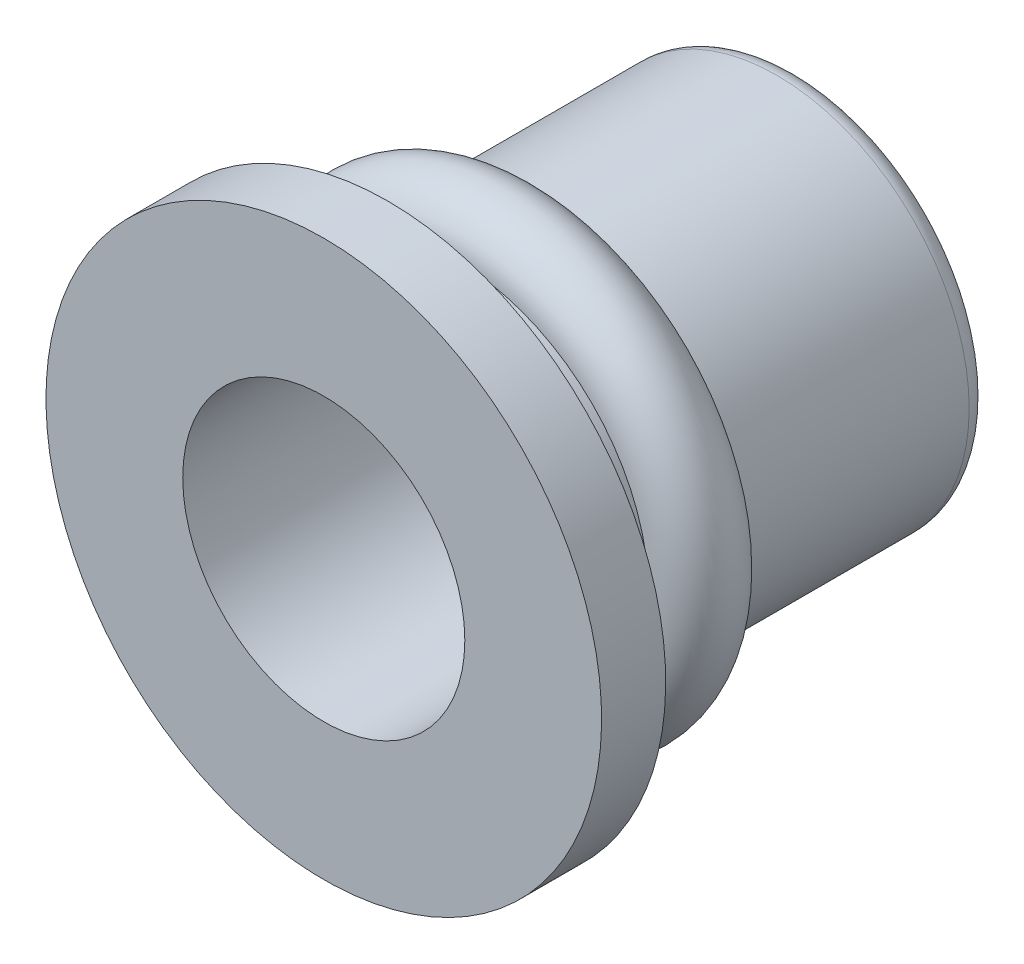
ISO-10303-21;
HEADER;
FILE_DESCRIPTION(('STEP AP214'),'2;1');
FILE_NAME('part.step','',(''),(''),'','','');
FILE_SCHEMA(('AUTOMOTIVE_DESIGN { 1 0 10303 214 1 1 1 1 }'));
ENDSEC;
DATA;
#1=APPLICATION_CONTEXT('core data for automotive mechanical design processes');
#2=APPLICATION_PROTOCOL_DEFINITION('international standard','automotive_design',2000,#1);
#3=PRODUCT_CONTEXT('',#1,'mechanical');
#4=PRODUCT('Part','Part','',(#3));
#5=PRODUCT_RELATED_PRODUCT_CATEGORY('part','',(#4));
#6=PRODUCT_DEFINITION_FORMATION('','',#4);
#7=PRODUCT_DEFINITION_CONTEXT('part definition',#1,'design');
#8=PRODUCT_DEFINITION('design','',#6,#7);
#9=PRODUCT_DEFINITION_SHAPE('','',#8);
#10=(LENGTH_UNIT() NAMED_UNIT(*) SI_UNIT(.MILLI.,.METRE.));
#11=(NAMED_UNIT(*) PLANE_ANGLE_UNIT() SI_UNIT($,.RADIAN.));
#12=(NAMED_UNIT(*) SI_UNIT($,.STERADIAN.) SOLID_ANGLE_UNIT());
#13=UNCERTAINTY_MEASURE_WITH_UNIT(LENGTH_MEASURE(1.E-05),#10,'distance_accuracy_value','');
#14=(GEOMETRIC_REPRESENTATION_CONTEXT(3) GLOBAL_UNCERTAINTY_ASSIGNED_CONTEXT((#13)) GLOBAL_UNIT_ASSIGNED_CONTEXT((#10,
#11,#12)) REPRESENTATION_CONTEXT('',''));
#15=CARTESIAN_POINT('',(0.,0.,0.));
#16=DIRECTION('',(0.,0.,1.));
#17=DIRECTION('',(1.,0.,0.));
#18=AXIS2_PLACEMENT_3D('',#15,#16,#17);
#19=CARTESIAN_POINT('',(0.,0.,0.));
#20=DIRECTION('',(0.,0.,1.));
#21=DIRECTION('',(0.,-1.,0.));
#22=AXIS2_PLACEMENT_3D('',#19,#20,#21);
#23=PLANE('',#22);
#24=CARTESIAN_POINT('',(0.,0.,0.));
#25=DIRECTION('',(0.,0.,1.));
#26=DIRECTION('',(1.,0.,0.));
#27=AXIS2_PLACEMENT_3D('',#24,#25,#26);
#28=CIRCLE('',#27,3.29999999999999);
#29=CARTESIAN_POINT('',(3.29999999999999,0.,0.));
#30=VERTEX_POINT('',#29);
#31=EDGE_CURVE('E59',#30,#30,#28,.T.);
#32=ORIENTED_EDGE('',*,*,#31,.F.);
#33=EDGE_LOOP('',(#32));
#34=FACE_BOUND('',#33,.T.);
#35=CARTESIAN_POINT('',(0.,0.,0.));
#36=DIRECTION('',(0.,0.,-1.));
#37=DIRECTION('',(0.,1.,0.));
#38=AXIS2_PLACEMENT_3D('',#35,#36,#37);
#39=CIRCLE('',#38,6.5);
#40=CARTESIAN_POINT('',(0.,6.5,0.));
#41=VERTEX_POINT('',#40);
#42=EDGE_CURVE('E10',#41,#41,#39,.T.);
#43=ORIENTED_EDGE('',*,*,#42,.F.);
#44=EDGE_LOOP('',(#43));
#45=FACE_BOUND('',#44,.T.);
#46=ADVANCED_FACE('F28',(#34,#45),#23,.T.);
#47=CARTESIAN_POINT('',(0.,0.,-11.1));
#48=DIRECTION('',(0.,0.,-1.));
#49=DIRECTION('',(0.,1.,0.));
#50=AXIS2_PLACEMENT_3D('',#47,#48,#49);
#51=CYLINDRICAL_SURFACE('',#50,6.5);
#52=ORIENTED_EDGE('',*,*,#42,.T.);
#53=EDGE_LOOP('',(#52));
#54=FACE_BOUND('',#53,.T.);
#55=CARTESIAN_POINT('',(0.,0.,-1.5));
#56=DIRECTION('',(0.,0.,-1.));
#57=DIRECTION('',(0.,1.,0.));
#58=AXIS2_PLACEMENT_3D('',#55,#56,#57);
#59=CIRCLE('',#58,6.5);
#60=CARTESIAN_POINT('',(0.,6.5,-1.5));
#61=VERTEX_POINT('',#60);
#62=EDGE_CURVE('E34',#61,#61,#59,.T.);
#63=ORIENTED_EDGE('',*,*,#62,.F.);
#64=EDGE_LOOP('',(#63));
#65=FACE_BOUND('',#64,.T.);
#66=ADVANCED_FACE('F67',(#54,#65),#51,.T.);
#67=CARTESIAN_POINT('',(0.,6.5,-1.5));
#68=DIRECTION('',(0.,0.,-1.));
#69=DIRECTION('',(0.,1.,0.));
#70=AXIS2_PLACEMENT_3D('',#67,#68,#69);
#71=PLANE('',#70);
#72=ORIENTED_EDGE('',*,*,#62,.T.);
#73=EDGE_LOOP('',(#72));
#74=FACE_BOUND('',#73,.T.);
#75=CARTESIAN_POINT('',(0.,0.,-1.5));
#76=DIRECTION('',(0.,0.,-1.));
#77=DIRECTION('',(0.,1.,0.));
#78=AXIS2_PLACEMENT_3D('',#75,#76,#77);
#79=CIRCLE('',#78,4.5);
#80=CARTESIAN_POINT('',(0.,4.5,-1.5));
#81=VERTEX_POINT('',#80);
#82=EDGE_CURVE('E38',#81,#81,#79,.T.);
#83=ORIENTED_EDGE('',*,*,#82,.F.);
#84=EDGE_LOOP('',(#83));
#85=FACE_BOUND('',#84,.T.);
#86=ADVANCED_FACE('F71',(#74,#85),#71,.T.);
#87=CARTESIAN_POINT('',(0.,0.,-11.1));
#88=DIRECTION('',(0.,0.,-1.));
#89=DIRECTION('',(0.,1.,0.));
#90=AXIS2_PLACEMENT_3D('',#87,#88,#89);
#91=CYLINDRICAL_SURFACE('',#90,4.5);
#92=ORIENTED_EDGE('',*,*,#82,.T.);
#93=EDGE_LOOP('',(#92));
#94=FACE_BOUND('',#93,.T.);
#95=CARTESIAN_POINT('',(0.,0.,-3.1));
#96=DIRECTION('',(0.,0.,-1.));
#97=DIRECTION('',(0.,1.,0.));
#98=AXIS2_PLACEMENT_3D('',#95,#96,#97);
#99=CIRCLE('',#98,4.5);
#100=CARTESIAN_POINT('',(0.,4.5,-3.1));
#101=VERTEX_POINT('',#100);
#102=EDGE_CURVE('E42',#101,#101,#99,.T.);
#103=ORIENTED_EDGE('',*,*,#102,.F.);
#104=EDGE_LOOP('',(#103));
#105=FACE_BOUND('',#104,.T.);
#106=ADVANCED_FACE('F75',(#94,#105),#91,.T.);
#107=CARTESIAN_POINT('',(0.,0.,-4.1));
#108=DIRECTION('',(0.,0.,-1.));
#109=DIRECTION('',(0.,1.,0.));
#110=AXIS2_PLACEMENT_3D('',#107,#108,#109);
#111=TOROIDAL_SURFACE('',#110,4.5,1.);
#112=ORIENTED_EDGE('',*,*,#102,.T.);
#113=EDGE_LOOP('',(#112));
#114=FACE_BOUND('',#113,.T.);
#115=CARTESIAN_POINT('',(0.,0.,-5.1));
#116=DIRECTION('',(0.,0.,-1.));
#117=DIRECTION('',(0.,1.,0.));
#118=AXIS2_PLACEMENT_3D('',#115,#116,#117);
#119=CIRCLE('',#118,4.5);
#120=CARTESIAN_POINT('',(0.,4.5,-5.1));
#121=VERTEX_POINT('',#120);
#122=EDGE_CURVE('E47',#121,#121,#119,.T.);
#123=ORIENTED_EDGE('',*,*,#122,.F.);
#124=EDGE_LOOP('',(#123));
#125=FACE_BOUND('',#124,.T.);
#126=ADVANCED_FACE('F81',(#114,#125),#111,.T.);
#127=CARTESIAN_POINT('',(0.,0.,-11.1));
#128=DIRECTION('',(0.,0.,-1.));
#129=DIRECTION('',(0.,1.,0.));
#130=AXIS2_PLACEMENT_3D('',#127,#128,#129);
#131=CYLINDRICAL_SURFACE('',#130,4.5);
#132=ORIENTED_EDGE('',*,*,#122,.T.);
#133=EDGE_LOOP('',(#132));
#134=FACE_BOUND('',#133,.T.);
#135=CARTESIAN_POINT('',(0.,0.,-10.6));
#136=DIRECTION('',(0.,0.,-1.));
#137=DIRECTION('',(0.,1.,0.));
#138=AXIS2_PLACEMENT_3D('',#135,#136,#137);
#139=CIRCLE('',#138,4.5);
#140=CARTESIAN_POINT('',(0.,4.5,-10.6));
#141=VERTEX_POINT('',#140);
#142=EDGE_CURVE('E50',#141,#141,#139,.T.);
#143=ORIENTED_EDGE('',*,*,#142,.F.);
#144=EDGE_LOOP('',(#143));
#145=FACE_BOUND('',#144,.T.);
#146=ADVANCED_FACE('F85',(#134,#145),#131,.T.);
#147=CARTESIAN_POINT('',(0.,0.,-10.6));
#148=DIRECTION('',(0.,0.,-1.));
#149=DIRECTION('',(0.,1.,0.));
#150=AXIS2_PLACEMENT_3D('',#147,#148,#149);
#151=TOROIDAL_SURFACE('',#150,4.,0.5);
#152=ORIENTED_EDGE('',*,*,#142,.T.);
#153=EDGE_LOOP('',(#152));
#154=FACE_BOUND('',#153,.T.);
#155=CARTESIAN_POINT('',(0.,0.,-11.1));
#156=DIRECTION('',(0.,0.,-1.));
#157=DIRECTION('',(0.,1.,0.));
#158=AXIS2_PLACEMENT_3D('',#155,#156,#157);
#159=CIRCLE('',#158,4.);
#160=CARTESIAN_POINT('',(0.,4.,-11.1));
#161=VERTEX_POINT('',#160);
#162=EDGE_CURVE('E53',#161,#161,#159,.T.);
#163=ORIENTED_EDGE('',*,*,#162,.F.);
#164=EDGE_LOOP('',(#163));
#165=FACE_BOUND('',#164,.T.);
#166=ADVANCED_FACE('F89',(#154,#165),#151,.T.);
#167=CARTESIAN_POINT('',(0.,4.,-11.1));
#168=DIRECTION('',(0.,0.,-1.));
#169=DIRECTION('',(0.,1.,0.));
#170=AXIS2_PLACEMENT_3D('',#167,#168,#169);
#171=PLANE('',#170);
#172=CARTESIAN_POINT('',(0.,0.,-11.1));
#173=DIRECTION('',(0.,0.,1.));
#174=DIRECTION('',(1.,0.,0.));
#175=AXIS2_PLACEMENT_3D('',#172,#173,#174);
#176=CIRCLE('',#175,3.3);
#177=CARTESIAN_POINT('',(3.3,0.,-11.1));
#178=VERTEX_POINT('',#177);
#179=EDGE_CURVE('E56',#178,#178,#176,.T.);
#180=ORIENTED_EDGE('',*,*,#179,.T.);
#181=EDGE_LOOP('',(#180));
#182=FACE_BOUND('',#181,.T.);
#183=ORIENTED_EDGE('',*,*,#162,.T.);
#184=EDGE_LOOP('',(#183));
#185=FACE_BOUND('',#184,.T.);
#186=ADVANCED_FACE('F93',(#182,#185),#171,.T.);
#187=CARTESIAN_POINT('',(0.,0.,0.));
#188=DIRECTION('',(0.,0.,1.));
#189=DIRECTION('',(1.,0.,0.));
#190=AXIS2_PLACEMENT_3D('',#187,#188,#189);
#191=CYLINDRICAL_SURFACE('',#190,3.29999999999999);
#192=ORIENTED_EDGE('',*,*,#179,.F.);
#193=EDGE_LOOP('',(#192));
#194=FACE_BOUND('',#193,.T.);
#195=ORIENTED_EDGE('',*,*,#31,.T.);
#196=EDGE_LOOP('',(#195));
#197=FACE_BOUND('',#196,.T.);
#198=ADVANCED_FACE('F63',(#194,#197),#191,.F.);
#199=CLOSED_SHELL('',(#46,#66,#86,#106,#126,#146,#166,#186,#198));
#200=MANIFOLD_SOLID_BREP('B2',#199);
#201=ADVANCED_BREP_SHAPE_REPRESENTATION('',(#18,#200),#14);
#202=SHAPE_DEFINITION_REPRESENTATION(#9,#201);
ENDSEC;
END-ISO-10303-21;
